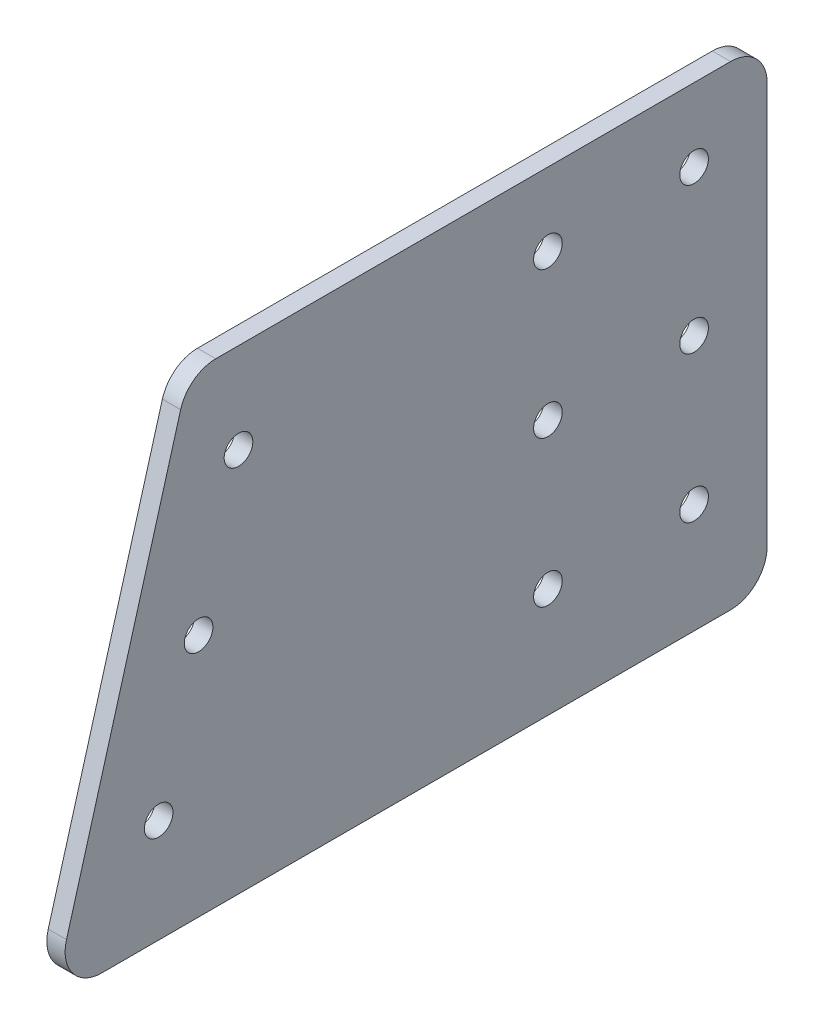
ISO-10303-21;
HEADER;
FILE_DESCRIPTION(('STEP AP214'),'2;1');
FILE_NAME('part.step','',(''),(''),'','','');
FILE_SCHEMA(('AUTOMOTIVE_DESIGN { 1 0 10303 214 1 1 1 1 }'));
ENDSEC;
DATA;
#1=APPLICATION_CONTEXT('core data for automotive mechanical design processes');
#2=APPLICATION_PROTOCOL_DEFINITION('international standard','automotive_design',2000,#1);
#3=PRODUCT_CONTEXT('',#1,'mechanical');
#4=PRODUCT('Part','Part','',(#3));
#5=PRODUCT_RELATED_PRODUCT_CATEGORY('part','',(#4));
#6=PRODUCT_DEFINITION_FORMATION('','',#4);
#7=PRODUCT_DEFINITION_CONTEXT('part definition',#1,'design');
#8=PRODUCT_DEFINITION('design','',#6,#7);
#9=PRODUCT_DEFINITION_SHAPE('','',#8);
#10=(LENGTH_UNIT() NAMED_UNIT(*) SI_UNIT(.MILLI.,.METRE.));
#11=(NAMED_UNIT(*) PLANE_ANGLE_UNIT() SI_UNIT($,.RADIAN.));
#12=(NAMED_UNIT(*) SI_UNIT($,.STERADIAN.) SOLID_ANGLE_UNIT());
#13=UNCERTAINTY_MEASURE_WITH_UNIT(LENGTH_MEASURE(1.E-05),#10,'distance_accuracy_value','');
#14=(GEOMETRIC_REPRESENTATION_CONTEXT(3) GLOBAL_UNCERTAINTY_ASSIGNED_CONTEXT((#13)) GLOBAL_UNIT_ASSIGNED_CONTEXT((#10,
#11,#12)) REPRESENTATION_CONTEXT('',''));
#15=CARTESIAN_POINT('',(0.,0.,0.));
#16=DIRECTION('',(0.,0.,1.));
#17=DIRECTION('',(1.,0.,0.));
#18=AXIS2_PLACEMENT_3D('',#15,#16,#17);
#19=CARTESIAN_POINT('',(1.5875,56.7396077259251,199.785828602502));
#20=DIRECTION('',(0.,-0.273198095926507,-0.96195779553062));
#21=DIRECTION('',(0.,0.96195779553062,-0.273198095926507));
#22=AXIS2_PLACEMENT_3D('',#19,#20,#21);
#23=PLANE('',#22);
#24=DIRECTION('',(0.,-0.96195779553062,0.273198095926507));
#25=VECTOR('',#24,1.);
#26=CARTESIAN_POINT('',(-1.5875,56.7396077259251,199.785828602502));
#27=LINE('',#26,#25);
#28=CARTESIAN_POINT('',(-1.5875,490.684807909133,76.5444525490906));
#29=VERTEX_POINT('',#28);
#30=CARTESIAN_POINT('',(-1.5875,420.834807909133,96.3820037276643));
#31=VERTEX_POINT('',#30);
#32=EDGE_CURVE('E138',#29,#31,#27,.T.);
#33=ORIENTED_EDGE('',*,*,#32,.T.);
#34=DIRECTION('',(-1.,0.,0.));
#35=VECTOR('',#34,1.);
#36=CARTESIAN_POINT('',(1.5875,420.834807909133,96.3820037276643));
#37=LINE('',#36,#35);
#38=CARTESIAN_POINT('',(1.5875,420.834807909133,96.3820037276643));
#39=VERTEX_POINT('',#38);
#40=EDGE_CURVE('E11',#31,#39,#37,.F.);
#41=ORIENTED_EDGE('',*,*,#40,.T.);
#42=DIRECTION('',(0.,-0.96195779553062,0.273198095926507));
#43=VECTOR('',#42,1.);
#44=CARTESIAN_POINT('',(1.5875,56.7396077259251,199.785828602502));
#45=LINE('',#44,#43);
#46=CARTESIAN_POINT('',(1.5875,490.684807909133,76.5444525490906));
#47=VERTEX_POINT('',#46);
#48=EDGE_CURVE('E168',#47,#39,#45,.T.);
#49=ORIENTED_EDGE('',*,*,#48,.F.);
#50=DIRECTION('',(-1.,0.,0.));
#51=VECTOR('',#50,1.);
#52=CARTESIAN_POINT('',(1.5875,490.684807909133,76.5444525490907));
#53=LINE('',#52,#51);
#54=EDGE_CURVE('E49',#47,#29,#53,.T.);
#55=ORIENTED_EDGE('',*,*,#54,.T.);
#56=EDGE_LOOP('',(#33,#41,#49,#55));
#57=FACE_BOUND('',#56,.T.);
#58=ADVANCED_FACE('F41',(#57),#23,.F.);
#59=CARTESIAN_POINT('',(1.5875,412.75,0.));
#60=DIRECTION('',(0.,1.,0.));
#61=DIRECTION('',(0.,0.,1.));
#62=AXIS2_PLACEMENT_3D('',#59,#60,#61);
#63=PLANE('',#62);
#64=DIRECTION('',(0.,0.,-1.));
#65=VECTOR('',#64,1.);
#66=CARTESIAN_POINT('',(-1.5875,412.75,0.));
#67=LINE('',#66,#65);
#68=CARTESIAN_POINT('',(-1.5875,412.75,90.2735717260448));
#69=VERTEX_POINT('',#68);
#70=CARTESIAN_POINT('',(-1.5875,412.75,-19.05));
#71=VERTEX_POINT('',#70);
#72=EDGE_CURVE('E134',#69,#71,#67,.T.);
#73=ORIENTED_EDGE('',*,*,#72,.T.);
#74=DIRECTION('',(-1.,0.,0.));
#75=VECTOR('',#74,1.);
#76=CARTESIAN_POINT('',(1.5875,412.75,-19.05));
#77=LINE('',#76,#75);
#78=CARTESIAN_POINT('',(1.5875,412.75,-19.05));
#79=VERTEX_POINT('',#78);
#80=EDGE_CURVE('E112',#71,#79,#77,.F.);
#81=ORIENTED_EDGE('',*,*,#80,.T.);
#82=DIRECTION('',(0.,0.,-1.));
#83=VECTOR('',#82,1.);
#84=CARTESIAN_POINT('',(1.5875,412.75,0.));
#85=LINE('',#84,#83);
#86=CARTESIAN_POINT('',(1.5875,412.75,90.2735717260448));
#87=VERTEX_POINT('',#86);
#88=EDGE_CURVE('E228',#87,#79,#85,.T.);
#89=ORIENTED_EDGE('',*,*,#88,.F.);
#90=DIRECTION('',(-1.,0.,0.));
#91=VECTOR('',#90,1.);
#92=CARTESIAN_POINT('',(1.5875,412.75,90.2735717260448));
#93=LINE('',#92,#91);
#94=EDGE_CURVE('E117',#87,#69,#93,.T.);
#95=ORIENTED_EDGE('',*,*,#94,.T.);
#96=EDGE_LOOP('',(#73,#81,#89,#95));
#97=FACE_BOUND('',#96,.T.);
#98=ADVANCED_FACE('F239',(#97),#63,.F.);
#99=CARTESIAN_POINT('',(1.5875,0.,-25.4));
#100=DIRECTION('',(0.,0.,1.));
#101=DIRECTION('',(0.,-1.,0.));
#102=AXIS2_PLACEMENT_3D('',#99,#100,#101);
#103=PLANE('',#102);
#104=DIRECTION('',(0.,1.,0.));
#105=VECTOR('',#104,1.);
#106=CARTESIAN_POINT('',(1.5875,0.,-25.4));
#107=LINE('',#106,#105);
#108=CARTESIAN_POINT('',(1.5875,419.1,-25.4));
#109=VERTEX_POINT('',#108);
#110=CARTESIAN_POINT('',(1.5875,488.95,-25.4));
#111=VERTEX_POINT('',#110);
#112=EDGE_CURVE('E126',#109,#111,#107,.T.);
#113=ORIENTED_EDGE('',*,*,#112,.F.);
#114=DIRECTION('',(-1.,0.,0.));
#115=VECTOR('',#114,1.);
#116=CARTESIAN_POINT('',(1.5875,419.1,-25.4));
#117=LINE('',#116,#115);
#118=CARTESIAN_POINT('',(-1.5875,419.1,-25.4));
#119=VERTEX_POINT('',#118);
#120=EDGE_CURVE('E111',#109,#119,#117,.T.);
#121=ORIENTED_EDGE('',*,*,#120,.T.);
#122=DIRECTION('',(0.,1.,0.));
#123=VECTOR('',#122,1.);
#124=CARTESIAN_POINT('',(-1.5875,0.,-25.4));
#125=LINE('',#124,#123);
#126=CARTESIAN_POINT('',(-1.5875,488.95,-25.4));
#127=VERTEX_POINT('',#126);
#128=EDGE_CURVE('E124',#119,#127,#125,.T.);
#129=ORIENTED_EDGE('',*,*,#128,.T.);
#130=DIRECTION('',(-1.,0.,0.));
#131=VECTOR('',#130,1.);
#132=CARTESIAN_POINT('',(1.5875,488.95,-25.4));
#133=LINE('',#132,#131);
#134=EDGE_CURVE('E128',#127,#111,#133,.F.);
#135=ORIENTED_EDGE('',*,*,#134,.T.);
#136=EDGE_LOOP('',(#113,#121,#129,#135));
#137=FACE_BOUND('',#136,.T.);
#138=ADVANCED_FACE('F123',(#137),#103,.F.);
#139=CARTESIAN_POINT('',(1.5875,479.613520178494,66.4864798215055));
#140=DIRECTION('',(-1.,0.,0.));
#141=DIRECTION('',(0.,0.,1.));
#142=AXIS2_PLACEMENT_3D('',#139,#140,#141);
#143=CYLINDRICAL_SURFACE('',#142,2.48920000000005);
#144=CARTESIAN_POINT('',(1.5875,479.613520178494,66.4864798215055));
#145=DIRECTION('',(1.,0.,0.));
#146=DIRECTION('',(0.,0.,-1.));
#147=AXIS2_PLACEMENT_3D('',#144,#145,#146);
#148=CIRCLE('',#147,2.48920000000005);
#149=CARTESIAN_POINT('',(1.5875,479.613520178494,63.9972798215054));
#150=VERTEX_POINT('',#149);
#151=EDGE_CURVE('E201',#150,#150,#148,.F.);
#152=ORIENTED_EDGE('',*,*,#151,.F.);
#153=EDGE_LOOP('',(#152));
#154=FACE_BOUND('',#153,.T.);
#155=CARTESIAN_POINT('',(-1.5875,479.613520178494,66.4864798215055));
#156=DIRECTION('',(1.,0.,0.));
#157=DIRECTION('',(0.,0.,-1.));
#158=AXIS2_PLACEMENT_3D('',#155,#156,#157);
#159=CIRCLE('',#158,2.48920000000005);
#160=CARTESIAN_POINT('',(-1.5875,479.613520178494,63.9972798215054));
#161=VERTEX_POINT('',#160);
#162=EDGE_CURVE('E162',#161,#161,#159,.F.);
#163=ORIENTED_EDGE('',*,*,#162,.T.);
#164=EDGE_LOOP('',(#163));
#165=FACE_BOUND('',#164,.T.);
#166=ADVANCED_FACE('F375',(#154,#165),#143,.F.);
#167=CARTESIAN_POINT('',(1.5875,455.179792172017,73.4257114580392));
#168=DIRECTION('',(-1.,0.,0.));
#169=DIRECTION('',(0.,0.,1.));
#170=AXIS2_PLACEMENT_3D('',#167,#168,#169);
#171=CYLINDRICAL_SURFACE('',#170,2.48920000000002);
#172=CARTESIAN_POINT('',(1.5875,455.179792172017,73.4257114580392));
#173=DIRECTION('',(1.,0.,0.));
#174=DIRECTION('',(0.,0.,-1.));
#175=AXIS2_PLACEMENT_3D('',#172,#173,#174);
#176=CIRCLE('',#175,2.48920000000002);
#177=CARTESIAN_POINT('',(1.5875,455.179792172017,70.9365114580392));
#178=VERTEX_POINT('',#177);
#179=EDGE_CURVE('E204',#178,#178,#176,.F.);
#180=ORIENTED_EDGE('',*,*,#179,.F.);
#181=EDGE_LOOP('',(#180));
#182=FACE_BOUND('',#181,.T.);
#183=CARTESIAN_POINT('',(-1.5875,455.179792172017,73.4257114580392));
#184=DIRECTION('',(1.,0.,0.));
#185=DIRECTION('',(0.,0.,-1.));
#186=AXIS2_PLACEMENT_3D('',#183,#184,#185);
#187=CIRCLE('',#186,2.48920000000002);
#188=CARTESIAN_POINT('',(-1.5875,455.179792172017,70.9365114580392));
#189=VERTEX_POINT('',#188);
#190=EDGE_CURVE('E159',#189,#189,#187,.F.);
#191=ORIENTED_EDGE('',*,*,#190,.T.);
#192=EDGE_LOOP('',(#191));
#193=FACE_BOUND('',#192,.T.);
#194=ADVANCED_FACE('F366',(#182,#193),#171,.F.);
#195=CARTESIAN_POINT('',(1.5875,482.6,12.7000000000002));
#196=DIRECTION('',(-1.,0.,0.));
#197=DIRECTION('',(0.,0.,1.));
#198=AXIS2_PLACEMENT_3D('',#195,#196,#197);
#199=CYLINDRICAL_SURFACE('',#198,2.4892);
#200=CARTESIAN_POINT('',(1.5875,482.6,12.7000000000002));
#201=DIRECTION('',(1.,0.,0.));
#202=DIRECTION('',(0.,0.,-1.));
#203=AXIS2_PLACEMENT_3D('',#200,#201,#202);
#204=CIRCLE('',#203,2.4892);
#205=CARTESIAN_POINT('',(1.5875,482.6,10.2108000000002));
#206=VERTEX_POINT('',#205);
#207=EDGE_CURVE('E207',#206,#206,#204,.T.);
#208=ORIENTED_EDGE('',*,*,#207,.T.);
#209=EDGE_LOOP('',(#208));
#210=FACE_BOUND('',#209,.T.);
#211=CARTESIAN_POINT('',(-1.5875,482.6,12.7000000000002));
#212=DIRECTION('',(1.,0.,0.));
#213=DIRECTION('',(0.,0.,-1.));
#214=AXIS2_PLACEMENT_3D('',#211,#212,#213);
#215=CIRCLE('',#214,2.4892);
#216=CARTESIAN_POINT('',(-1.5875,482.6,10.2108000000002));
#217=VERTEX_POINT('',#216);
#218=EDGE_CURVE('E156',#217,#217,#215,.T.);
#219=ORIENTED_EDGE('',*,*,#218,.F.);
#220=EDGE_LOOP('',(#219));
#221=FACE_BOUND('',#220,.T.);
#222=ADVANCED_FACE('F357',(#210,#221),#199,.F.);
#223=CARTESIAN_POINT('',(1.5875,482.6,-12.6999999999998));
#224=DIRECTION('',(-1.,0.,0.));
#225=DIRECTION('',(0.,0.,1.));
#226=AXIS2_PLACEMENT_3D('',#223,#224,#225);
#227=CYLINDRICAL_SURFACE('',#226,2.4892);
#228=CARTESIAN_POINT('',(1.5875,482.6,-12.6999999999998));
#229=DIRECTION('',(1.,0.,0.));
#230=DIRECTION('',(0.,0.,-1.));
#231=AXIS2_PLACEMENT_3D('',#228,#229,#230);
#232=CIRCLE('',#231,2.4892);
#233=CARTESIAN_POINT('',(1.5875,482.6,-15.1891999999998));
#234=VERTEX_POINT('',#233);
#235=EDGE_CURVE('E210',#234,#234,#232,.T.);
#236=ORIENTED_EDGE('',*,*,#235,.T.);
#237=EDGE_LOOP('',(#236));
#238=FACE_BOUND('',#237,.T.);
#239=CARTESIAN_POINT('',(-1.5875,482.6,-12.6999999999998));
#240=DIRECTION('',(1.,0.,0.));
#241=DIRECTION('',(0.,0.,-1.));
#242=AXIS2_PLACEMENT_3D('',#239,#240,#241);
#243=CIRCLE('',#242,2.4892);
#244=CARTESIAN_POINT('',(-1.5875,482.6,-15.1891999999998));
#245=VERTEX_POINT('',#244);
#246=EDGE_CURVE('E153',#245,#245,#243,.T.);
#247=ORIENTED_EDGE('',*,*,#246,.F.);
#248=EDGE_LOOP('',(#247));
#249=FACE_BOUND('',#248,.T.);
#250=ADVANCED_FACE('F348',(#238,#249),#227,.F.);
#251=CARTESIAN_POINT('',(1.5875,457.2,-12.6999999999998));
#252=DIRECTION('',(-1.,0.,0.));
#253=DIRECTION('',(0.,0.,1.));
#254=AXIS2_PLACEMENT_3D('',#251,#252,#253);
#255=CYLINDRICAL_SURFACE('',#254,2.48920000000002);
#256=CARTESIAN_POINT('',(1.5875,457.2,-12.6999999999998));
#257=DIRECTION('',(1.,0.,0.));
#258=DIRECTION('',(0.,0.,-1.));
#259=AXIS2_PLACEMENT_3D('',#256,#257,#258);
#260=CIRCLE('',#259,2.48920000000002);
#261=CARTESIAN_POINT('',(1.5875,457.2,-15.1891999999998));
#262=VERTEX_POINT('',#261);
#263=EDGE_CURVE('E213',#262,#262,#260,.T.);
#264=ORIENTED_EDGE('',*,*,#263,.T.);
#265=EDGE_LOOP('',(#264));
#266=FACE_BOUND('',#265,.T.);
#267=CARTESIAN_POINT('',(-1.5875,457.2,-12.6999999999998));
#268=DIRECTION('',(1.,0.,0.));
#269=DIRECTION('',(0.,0.,-1.));
#270=AXIS2_PLACEMENT_3D('',#267,#268,#269);
#271=CIRCLE('',#270,2.48920000000002);
#272=CARTESIAN_POINT('',(-1.5875,457.2,-15.1891999999998));
#273=VERTEX_POINT('',#272);
#274=EDGE_CURVE('E150',#273,#273,#271,.T.);
#275=ORIENTED_EDGE('',*,*,#274,.F.);
#276=EDGE_LOOP('',(#275));
#277=FACE_BOUND('',#276,.T.);
#278=ADVANCED_FACE('F339',(#266,#277),#255,.F.);
#279=CARTESIAN_POINT('',(1.5875,431.8,-12.6999999999998));
#280=DIRECTION('',(-1.,0.,0.));
#281=DIRECTION('',(0.,0.,1.));
#282=AXIS2_PLACEMENT_3D('',#279,#280,#281);
#283=CYLINDRICAL_SURFACE('',#282,2.48920000000002);
#284=CARTESIAN_POINT('',(1.5875,431.8,-12.6999999999998));
#285=DIRECTION('',(1.,0.,0.));
#286=DIRECTION('',(0.,0.,-1.));
#287=AXIS2_PLACEMENT_3D('',#284,#285,#286);
#288=CIRCLE('',#287,2.48920000000002);
#289=CARTESIAN_POINT('',(1.5875,431.8,-15.1891999999998));
#290=VERTEX_POINT('',#289);
#291=EDGE_CURVE('E216',#290,#290,#288,.T.);
#292=ORIENTED_EDGE('',*,*,#291,.T.);
#293=EDGE_LOOP('',(#292));
#294=FACE_BOUND('',#293,.T.);
#295=CARTESIAN_POINT('',(-1.5875,431.8,-12.6999999999998));
#296=DIRECTION('',(1.,0.,0.));
#297=DIRECTION('',(0.,0.,-1.));
#298=AXIS2_PLACEMENT_3D('',#295,#296,#297);
#299=CIRCLE('',#298,2.48920000000002);
#300=CARTESIAN_POINT('',(-1.5875,431.8,-15.1891999999998));
#301=VERTEX_POINT('',#300);
#302=EDGE_CURVE('E147',#301,#301,#299,.T.);
#303=ORIENTED_EDGE('',*,*,#302,.F.);
#304=EDGE_LOOP('',(#303));
#305=FACE_BOUND('',#304,.T.);
#306=ADVANCED_FACE('F330',(#294,#305),#283,.F.);
#307=CARTESIAN_POINT('',(1.5875,457.2,12.7000000000002));
#308=DIRECTION('',(-1.,0.,0.));
#309=DIRECTION('',(0.,0.,1.));
#310=AXIS2_PLACEMENT_3D('',#307,#308,#309);
#311=CYLINDRICAL_SURFACE('',#310,2.48920000000002);
#312=CARTESIAN_POINT('',(1.5875,457.2,12.7000000000002));
#313=DIRECTION('',(1.,0.,0.));
#314=DIRECTION('',(0.,0.,-1.));
#315=AXIS2_PLACEMENT_3D('',#312,#313,#314);
#316=CIRCLE('',#315,2.48920000000002);
#317=CARTESIAN_POINT('',(1.5875,457.2,10.2108000000002));
#318=VERTEX_POINT('',#317);
#319=EDGE_CURVE('E219',#318,#318,#316,.T.);
#320=ORIENTED_EDGE('',*,*,#319,.T.);
#321=EDGE_LOOP('',(#320));
#322=FACE_BOUND('',#321,.T.);
#323=CARTESIAN_POINT('',(-1.5875,457.2,12.7000000000002));
#324=DIRECTION('',(1.,0.,0.));
#325=DIRECTION('',(0.,0.,-1.));
#326=AXIS2_PLACEMENT_3D('',#323,#324,#325);
#327=CIRCLE('',#326,2.48920000000002);
#328=CARTESIAN_POINT('',(-1.5875,457.2,10.2108000000002));
#329=VERTEX_POINT('',#328);
#330=EDGE_CURVE('E144',#329,#329,#327,.T.);
#331=ORIENTED_EDGE('',*,*,#330,.F.);
#332=EDGE_LOOP('',(#331));
#333=FACE_BOUND('',#332,.T.);
#334=ADVANCED_FACE('F321',(#322,#333),#311,.F.);
#335=CARTESIAN_POINT('',(1.5875,431.8,12.7000000000002));
#336=DIRECTION('',(-1.,0.,0.));
#337=DIRECTION('',(0.,0.,1.));
#338=AXIS2_PLACEMENT_3D('',#335,#336,#337);
#339=CYLINDRICAL_SURFACE('',#338,2.48920000000002);
#340=CARTESIAN_POINT('',(1.5875,431.8,12.7000000000002));
#341=DIRECTION('',(1.,0.,0.));
#342=DIRECTION('',(0.,0.,-1.));
#343=AXIS2_PLACEMENT_3D('',#340,#341,#342);
#344=CIRCLE('',#343,2.48920000000002);
#345=CARTESIAN_POINT('',(1.5875,431.8,10.2108000000002));
#346=VERTEX_POINT('',#345);
#347=EDGE_CURVE('E222',#346,#346,#344,.T.);
#348=ORIENTED_EDGE('',*,*,#347,.T.);
#349=EDGE_LOOP('',(#348));
#350=FACE_BOUND('',#349,.T.);
#351=CARTESIAN_POINT('',(-1.5875,431.8,12.7000000000002));
#352=DIRECTION('',(1.,0.,0.));
#353=DIRECTION('',(0.,0.,-1.));
#354=AXIS2_PLACEMENT_3D('',#351,#352,#353);
#355=CIRCLE('',#354,2.48920000000002);
#356=CARTESIAN_POINT('',(-1.5875,431.8,10.2108000000002));
#357=VERTEX_POINT('',#356);
#358=EDGE_CURVE('E136',#357,#357,#355,.T.);
#359=ORIENTED_EDGE('',*,*,#358,.F.);
#360=EDGE_LOOP('',(#359));
#361=FACE_BOUND('',#360,.T.);
#362=ADVANCED_FACE('F313',(#350,#361),#339,.F.);
#363=CARTESIAN_POINT('',(1.5875,495.3,0.));
#364=DIRECTION('',(0.,-1.,0.));
#365=DIRECTION('',(0.,0.,-1.));
#366=AXIS2_PLACEMENT_3D('',#363,#364,#365);
#367=PLANE('',#366);
#368=DIRECTION('',(0.,0.,1.));
#369=VECTOR('',#368,1.);
#370=CARTESIAN_POINT('',(1.5875,495.3,0.));
#371=LINE('',#370,#369);
#372=CARTESIAN_POINT('',(1.5875,495.3,-19.05));
#373=VERTEX_POINT('',#372);
#374=CARTESIAN_POINT('',(1.5875,495.3,70.4360205474712));
#375=VERTEX_POINT('',#374);
#376=EDGE_CURVE('E225',#373,#375,#371,.T.);
#377=ORIENTED_EDGE('',*,*,#376,.F.);
#378=DIRECTION('',(-1.,0.,0.));
#379=VECTOR('',#378,1.);
#380=CARTESIAN_POINT('',(1.5875,495.3,-19.05));
#381=LINE('',#380,#379);
#382=CARTESIAN_POINT('',(-1.5875,495.3,-19.05));
#383=VERTEX_POINT('',#382);
#384=EDGE_CURVE('E186',#373,#383,#381,.T.);
#385=ORIENTED_EDGE('',*,*,#384,.T.);
#386=DIRECTION('',(0.,0.,1.));
#387=VECTOR('',#386,1.);
#388=CARTESIAN_POINT('',(-1.5875,495.3,0.));
#389=LINE('',#388,#387);
#390=CARTESIAN_POINT('',(-1.5875,495.3,70.4360205474712));
#391=VERTEX_POINT('',#390);
#392=EDGE_CURVE('E133',#383,#391,#389,.T.);
#393=ORIENTED_EDGE('',*,*,#392,.T.);
#394=DIRECTION('',(-1.,0.,0.));
#395=VECTOR('',#394,1.);
#396=CARTESIAN_POINT('',(1.5875,495.3,70.4360205474712));
#397=LINE('',#396,#395);
#398=EDGE_CURVE('E56',#391,#375,#397,.F.);
#399=ORIENTED_EDGE('',*,*,#398,.T.);
#400=EDGE_LOOP('',(#377,#385,#393,#399));
#401=FACE_BOUND('',#400,.T.);
#402=ADVANCED_FACE('F243',(#401),#367,.F.);
#403=CARTESIAN_POINT('',(1.5875,430.746064165539,80.3649430945726));
#404=DIRECTION('',(-1.,0.,0.));
#405=DIRECTION('',(0.,0.,1.));
#406=AXIS2_PLACEMENT_3D('',#403,#404,#405);
#407=CYLINDRICAL_SURFACE('',#406,2.48920000000002);
#408=CARTESIAN_POINT('',(1.5875,430.746064165539,80.3649430945726));
#409=DIRECTION('',(1.,0.,0.));
#410=DIRECTION('',(0.,0.,-1.));
#411=AXIS2_PLACEMENT_3D('',#408,#409,#410);
#412=CIRCLE('',#411,2.48920000000002);
#413=CARTESIAN_POINT('',(1.5875,430.746064165539,77.8757430945726));
#414=VERTEX_POINT('',#413);
#415=EDGE_CURVE('E169',#414,#414,#412,.F.);
#416=ORIENTED_EDGE('',*,*,#415,.F.);
#417=EDGE_LOOP('',(#416));
#418=FACE_BOUND('',#417,.T.);
#419=CARTESIAN_POINT('',(-1.5875,430.746064165539,80.3649430945726));
#420=DIRECTION('',(1.,0.,0.));
#421=DIRECTION('',(0.,0.,-1.));
#422=AXIS2_PLACEMENT_3D('',#419,#420,#421);
#423=CIRCLE('',#422,2.48920000000002);
#424=CARTESIAN_POINT('',(-1.5875,430.746064165539,77.8757430945726));
#425=VERTEX_POINT('',#424);
#426=EDGE_CURVE('E165',#425,#425,#423,.F.);
#427=ORIENTED_EDGE('',*,*,#426,.T.);
#428=EDGE_LOOP('',(#427));
#429=FACE_BOUND('',#428,.T.);
#430=ADVANCED_FACE('F297',(#418,#429),#407,.F.);
#431=CARTESIAN_POINT('',(1.5875,0.,0.));
#432=DIRECTION('',(1.,0.,0.));
#433=DIRECTION('',(0.,0.,-1.));
#434=AXIS2_PLACEMENT_3D('',#431,#432,#433);
#435=PLANE('',#434);
#436=ORIENTED_EDGE('',*,*,#88,.T.);
#437=CARTESIAN_POINT('',(1.5875,419.1,-19.05));
#438=DIRECTION('',(1.,0.,0.));
#439=DIRECTION('',(0.,0.,-1.));
#440=AXIS2_PLACEMENT_3D('',#437,#438,#439);
#441=CIRCLE('',#440,6.35);
#442=EDGE_CURVE('E183',#79,#109,#441,.T.);
#443=ORIENTED_EDGE('',*,*,#442,.T.);
#444=ORIENTED_EDGE('',*,*,#112,.T.);
#445=CARTESIAN_POINT('',(1.5875,488.95,-19.05));
#446=DIRECTION('',(1.,0.,0.));
#447=DIRECTION('',(0.,0.,-1.));
#448=AXIS2_PLACEMENT_3D('',#445,#446,#447);
#449=CIRCLE('',#448,6.35);
#450=EDGE_CURVE('E63',#111,#373,#449,.T.);
#451=ORIENTED_EDGE('',*,*,#450,.T.);
#452=ORIENTED_EDGE('',*,*,#376,.T.);
#453=CARTESIAN_POINT('',(1.5875,488.95,70.4360205474712));
#454=DIRECTION('',(1.,0.,0.));
#455=DIRECTION('',(0.,0.,-1.));
#456=AXIS2_PLACEMENT_3D('',#453,#454,#455);
#457=CIRCLE('',#456,6.35);
#458=EDGE_CURVE('E178',#375,#47,#457,.T.);
#459=ORIENTED_EDGE('',*,*,#458,.T.);
#460=ORIENTED_EDGE('',*,*,#48,.T.);
#461=CARTESIAN_POINT('',(1.5875,419.1,90.2735717260448));
#462=DIRECTION('',(1.,0.,0.));
#463=DIRECTION('',(0.,0.,-1.));
#464=AXIS2_PLACEMENT_3D('',#461,#462,#463);
#465=CIRCLE('',#464,6.35);
#466=EDGE_CURVE('E180',#39,#87,#465,.T.);
#467=ORIENTED_EDGE('',*,*,#466,.T.);
#468=EDGE_LOOP('',(#436,#443,#444,#451,#452,#459,#460,#467));
#469=FACE_BOUND('',#468,.T.);
#470=ORIENTED_EDGE('',*,*,#347,.F.);
#471=EDGE_LOOP('',(#470));
#472=FACE_BOUND('',#471,.T.);
#473=ORIENTED_EDGE('',*,*,#319,.F.);
#474=EDGE_LOOP('',(#473));
#475=FACE_BOUND('',#474,.T.);
#476=ORIENTED_EDGE('',*,*,#291,.F.);
#477=EDGE_LOOP('',(#476));
#478=FACE_BOUND('',#477,.T.);
#479=ORIENTED_EDGE('',*,*,#263,.F.);
#480=EDGE_LOOP('',(#479));
#481=FACE_BOUND('',#480,.T.);
#482=ORIENTED_EDGE('',*,*,#235,.F.);
#483=EDGE_LOOP('',(#482));
#484=FACE_BOUND('',#483,.T.);
#485=ORIENTED_EDGE('',*,*,#207,.F.);
#486=EDGE_LOOP('',(#485));
#487=FACE_BOUND('',#486,.T.);
#488=ORIENTED_EDGE('',*,*,#179,.T.);
#489=EDGE_LOOP('',(#488));
#490=FACE_BOUND('',#489,.T.);
#491=ORIENTED_EDGE('',*,*,#151,.T.);
#492=EDGE_LOOP('',(#491));
#493=FACE_BOUND('',#492,.T.);
#494=ORIENTED_EDGE('',*,*,#415,.T.);
#495=EDGE_LOOP('',(#494));
#496=FACE_BOUND('',#495,.T.);
#497=ADVANCED_FACE('F232',(#469,#472,#475,#478,#481,#484,#487,#490,#493,#496),#435,.T.);
#498=CARTESIAN_POINT('',(-1.5875,0.,0.));
#499=DIRECTION('',(1.,0.,0.));
#500=DIRECTION('',(0.,0.,-1.));
#501=AXIS2_PLACEMENT_3D('',#498,#499,#500);
#502=PLANE('',#501);
#503=ORIENTED_EDGE('',*,*,#128,.F.);
#504=CARTESIAN_POINT('',(-1.5875,419.1,-19.05));
#505=DIRECTION('',(1.,0.,0.));
#506=DIRECTION('',(0.,0.,-1.));
#507=AXIS2_PLACEMENT_3D('',#504,#505,#506);
#508=CIRCLE('',#507,6.35);
#509=EDGE_CURVE('E107',#119,#71,#508,.F.);
#510=ORIENTED_EDGE('',*,*,#509,.T.);
#511=ORIENTED_EDGE('',*,*,#72,.F.);
#512=CARTESIAN_POINT('',(-1.5875,419.1,90.2735717260448));
#513=DIRECTION('',(1.,0.,0.));
#514=DIRECTION('',(0.,0.,-1.));
#515=AXIS2_PLACEMENT_3D('',#512,#513,#514);
#516=CIRCLE('',#515,6.35);
#517=EDGE_CURVE('E172',#69,#31,#516,.F.);
#518=ORIENTED_EDGE('',*,*,#517,.T.);
#519=ORIENTED_EDGE('',*,*,#32,.F.);
#520=CARTESIAN_POINT('',(-1.5875,488.95,70.4360205474712));
#521=DIRECTION('',(1.,0.,0.));
#522=DIRECTION('',(0.,0.,-1.));
#523=AXIS2_PLACEMENT_3D('',#520,#521,#522);
#524=CIRCLE('',#523,6.35);
#525=EDGE_CURVE('E127',#29,#391,#524,.F.);
#526=ORIENTED_EDGE('',*,*,#525,.T.);
#527=ORIENTED_EDGE('',*,*,#392,.F.);
#528=CARTESIAN_POINT('',(-1.5875,488.95,-19.05));
#529=DIRECTION('',(1.,0.,0.));
#530=DIRECTION('',(0.,0.,-1.));
#531=AXIS2_PLACEMENT_3D('',#528,#529,#530);
#532=CIRCLE('',#531,6.35);
#533=EDGE_CURVE('E118',#383,#127,#532,.F.);
#534=ORIENTED_EDGE('',*,*,#533,.T.);
#535=EDGE_LOOP('',(#503,#510,#511,#518,#519,#526,#527,#534));
#536=FACE_BOUND('',#535,.T.);
#537=ORIENTED_EDGE('',*,*,#358,.T.);
#538=EDGE_LOOP('',(#537));
#539=FACE_BOUND('',#538,.T.);
#540=ORIENTED_EDGE('',*,*,#330,.T.);
#541=EDGE_LOOP('',(#540));
#542=FACE_BOUND('',#541,.T.);
#543=ORIENTED_EDGE('',*,*,#302,.T.);
#544=EDGE_LOOP('',(#543));
#545=FACE_BOUND('',#544,.T.);
#546=ORIENTED_EDGE('',*,*,#274,.T.);
#547=EDGE_LOOP('',(#546));
#548=FACE_BOUND('',#547,.T.);
#549=ORIENTED_EDGE('',*,*,#246,.T.);
#550=EDGE_LOOP('',(#549));
#551=FACE_BOUND('',#550,.T.);
#552=ORIENTED_EDGE('',*,*,#218,.T.);
#553=EDGE_LOOP('',(#552));
#554=FACE_BOUND('',#553,.T.);
#555=ORIENTED_EDGE('',*,*,#190,.F.);
#556=EDGE_LOOP('',(#555));
#557=FACE_BOUND('',#556,.T.);
#558=ORIENTED_EDGE('',*,*,#162,.F.);
#559=EDGE_LOOP('',(#558));
#560=FACE_BOUND('',#559,.T.);
#561=ORIENTED_EDGE('',*,*,#426,.F.);
#562=EDGE_LOOP('',(#561));
#563=FACE_BOUND('',#562,.T.);
#564=ADVANCED_FACE('F130',(#536,#539,#542,#545,#548,#551,#554,#557,#560,#563),#502,.F.);
#565=CARTESIAN_POINT('',(1.5875,419.1,-19.05));
#566=DIRECTION('',(-1.,0.,0.));
#567=DIRECTION('',(0.,0.,1.));
#568=AXIS2_PLACEMENT_3D('',#565,#566,#567);
#569=CYLINDRICAL_SURFACE('',#568,6.35);
#570=ORIENTED_EDGE('',*,*,#442,.F.);
#571=ORIENTED_EDGE('',*,*,#80,.F.);
#572=ORIENTED_EDGE('',*,*,#509,.F.);
#573=ORIENTED_EDGE('',*,*,#120,.F.);
#574=EDGE_LOOP('',(#570,#571,#572,#573));
#575=FACE_BOUND('',#574,.T.);
#576=ADVANCED_FACE('F110',(#575),#569,.T.);
#577=CARTESIAN_POINT('',(1.5875,488.95,-19.05));
#578=DIRECTION('',(-1.,0.,0.));
#579=DIRECTION('',(0.,0.,1.));
#580=AXIS2_PLACEMENT_3D('',#577,#578,#579);
#581=CYLINDRICAL_SURFACE('',#580,6.35);
#582=ORIENTED_EDGE('',*,*,#450,.F.);
#583=ORIENTED_EDGE('',*,*,#134,.F.);
#584=ORIENTED_EDGE('',*,*,#533,.F.);
#585=ORIENTED_EDGE('',*,*,#384,.F.);
#586=EDGE_LOOP('',(#582,#583,#584,#585));
#587=FACE_BOUND('',#586,.T.);
#588=ADVANCED_FACE('F242',(#587),#581,.T.);
#589=CARTESIAN_POINT('',(1.5875,419.1,90.2735717260448));
#590=DIRECTION('',(-1.,0.,0.));
#591=DIRECTION('',(0.,0.,1.));
#592=AXIS2_PLACEMENT_3D('',#589,#590,#591);
#593=CYLINDRICAL_SURFACE('',#592,6.35);
#594=ORIENTED_EDGE('',*,*,#466,.F.);
#595=ORIENTED_EDGE('',*,*,#40,.F.);
#596=ORIENTED_EDGE('',*,*,#517,.F.);
#597=ORIENTED_EDGE('',*,*,#94,.F.);
#598=EDGE_LOOP('',(#594,#595,#596,#597));
#599=FACE_BOUND('',#598,.T.);
#600=ADVANCED_FACE('F237',(#599),#593,.T.);
#601=CARTESIAN_POINT('',(1.5875,488.95,70.4360205474712));
#602=DIRECTION('',(-1.,0.,0.));
#603=DIRECTION('',(0.,0.,1.));
#604=AXIS2_PLACEMENT_3D('',#601,#602,#603);
#605=CYLINDRICAL_SURFACE('',#604,6.35);
#606=ORIENTED_EDGE('',*,*,#458,.F.);
#607=ORIENTED_EDGE('',*,*,#398,.F.);
#608=ORIENTED_EDGE('',*,*,#525,.F.);
#609=ORIENTED_EDGE('',*,*,#54,.F.);
#610=EDGE_LOOP('',(#606,#607,#608,#609));
#611=FACE_BOUND('',#610,.T.);
#612=ADVANCED_FACE('F43',(#611),#605,.T.);
#613=CLOSED_SHELL('',(#58,#98,#138,#166,#194,#222,#250,#278,#306,#334,#362,#402,#430,#497,#564,
#576,#588,#600,#612));
#614=MANIFOLD_SOLID_BREP('B2',#613);
#615=ADVANCED_BREP_SHAPE_REPRESENTATION('',(#18,#614),#14);
#616=SHAPE_DEFINITION_REPRESENTATION(#9,#615);
ENDSEC;
END-ISO-10303-21;
